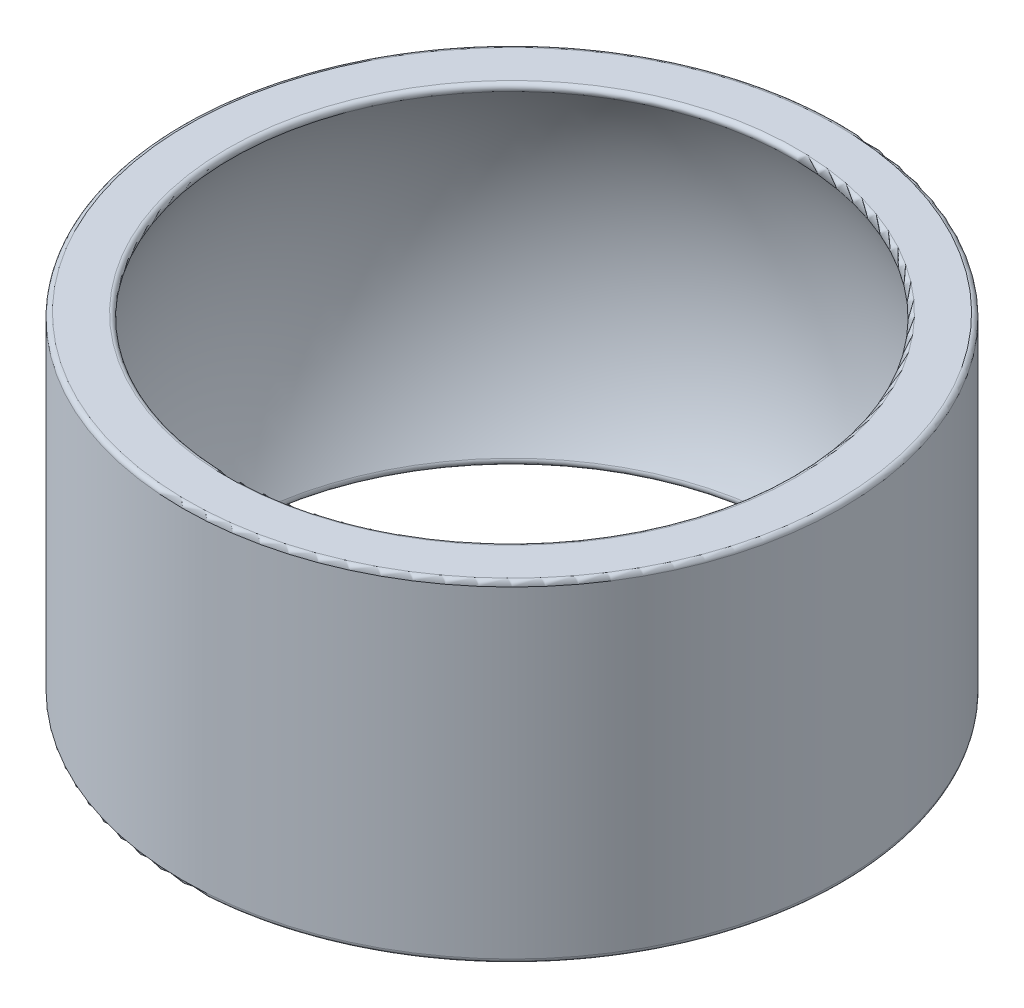
ISO-10303-21;
HEADER;
FILE_DESCRIPTION(('STEP AP214'),'2;1');
FILE_NAME('part.step','',(''),(''),'','','');
FILE_SCHEMA(('AUTOMOTIVE_DESIGN { 1 0 10303 214 1 1 1 1 }'));
ENDSEC;
DATA;
#1=APPLICATION_CONTEXT('core data for automotive mechanical design processes');
#2=APPLICATION_PROTOCOL_DEFINITION('international standard','automotive_design',2000,#1);
#3=PRODUCT_CONTEXT('',#1,'mechanical');
#4=PRODUCT('Part','Part','',(#3));
#5=PRODUCT_RELATED_PRODUCT_CATEGORY('part','',(#4));
#6=PRODUCT_DEFINITION_FORMATION('','',#4);
#7=PRODUCT_DEFINITION_CONTEXT('part definition',#1,'design');
#8=PRODUCT_DEFINITION('design','',#6,#7);
#9=PRODUCT_DEFINITION_SHAPE('','',#8);
#10=(LENGTH_UNIT() NAMED_UNIT(*) SI_UNIT(.MILLI.,.METRE.));
#11=(NAMED_UNIT(*) PLANE_ANGLE_UNIT() SI_UNIT($,.RADIAN.));
#12=(NAMED_UNIT(*) SI_UNIT($,.STERADIAN.) SOLID_ANGLE_UNIT());
#13=UNCERTAINTY_MEASURE_WITH_UNIT(LENGTH_MEASURE(1.E-05),#10,'distance_accuracy_value','');
#14=(GEOMETRIC_REPRESENTATION_CONTEXT(3) GLOBAL_UNCERTAINTY_ASSIGNED_CONTEXT((#13)) GLOBAL_UNIT_ASSIGNED_CONTEXT((#10,
#11,#12)) REPRESENTATION_CONTEXT('',''));
#15=CARTESIAN_POINT('',(0.,0.,0.));
#16=DIRECTION('',(0.,0.,1.));
#17=DIRECTION('',(1.,0.,0.));
#18=AXIS2_PLACEMENT_3D('',#15,#16,#17);
#19=CARTESIAN_POINT('',(0.,11.,0.));
#20=DIRECTION('',(0.,1.,0.));
#21=DIRECTION('',(-1.,0.,0.));
#22=AXIS2_PLACEMENT_3D('',#19,#20,#21);
#23=CYLINDRICAL_SURFACE('',#22,21.8917792789896);
#24=CARTESIAN_POINT('',(0.,-10.7,0.));
#25=DIRECTION('',(0.,1.,0.));
#26=DIRECTION('',(-1.,0.,0.));
#27=AXIS2_PLACEMENT_3D('',#24,#25,#26);
#28=CIRCLE('',#27,21.8917792789896);
#29=CARTESIAN_POINT('',(-21.8917792789896,-10.7,0.));
#30=VERTEX_POINT('',#29);
#31=EDGE_CURVE('E10',#30,#30,#28,.T.);
#32=ORIENTED_EDGE('',*,*,#31,.T.);
#33=EDGE_LOOP('',(#32));
#34=FACE_BOUND('',#33,.T.);
#35=CARTESIAN_POINT('',(0.,10.7,0.));
#36=DIRECTION('',(0.,-1.,0.));
#37=DIRECTION('',(1.,0.,0.));
#38=AXIS2_PLACEMENT_3D('',#35,#36,#37);
#39=CIRCLE('',#38,21.8917792789896);
#40=CARTESIAN_POINT('',(21.8917792789896,10.7,0.));
#41=VERTEX_POINT('',#40);
#42=EDGE_CURVE('E39',#41,#41,#39,.T.);
#43=ORIENTED_EDGE('',*,*,#42,.T.);
#44=EDGE_LOOP('',(#43));
#45=FACE_BOUND('',#44,.T.);
#46=ADVANCED_FACE('F32',(#34,#45),#23,.T.);
#47=CARTESIAN_POINT('',(18.3856091821838,11.,0.));
#48=DIRECTION('',(0.,-1.,0.));
#49=DIRECTION('',(1.,0.,0.));
#50=AXIS2_PLACEMENT_3D('',#47,#48,#49);
#51=PLANE('',#50);
#52=CARTESIAN_POINT('',(0.,11.,0.));
#53=DIRECTION('',(0.,-1.,0.));
#54=DIRECTION('',(1.,0.,0.));
#55=AXIS2_PLACEMENT_3D('',#52,#53,#54);
#56=CIRCLE('',#55,18.9072902606376);
#57=CARTESIAN_POINT('',(18.9072902606376,11.,0.));
#58=VERTEX_POINT('',#57);
#59=EDGE_CURVE('E52',#58,#58,#56,.T.);
#60=ORIENTED_EDGE('',*,*,#59,.T.);
#61=EDGE_LOOP('',(#60));
#62=FACE_BOUND('',#61,.T.);
#63=CARTESIAN_POINT('',(0.,11.,0.));
#64=DIRECTION('',(0.,-1.,0.));
#65=DIRECTION('',(1.,0.,0.));
#66=AXIS2_PLACEMENT_3D('',#63,#64,#65);
#67=CIRCLE('',#66,21.5917792789896);
#68=CARTESIAN_POINT('',(21.5917792789896,11.,0.));
#69=VERTEX_POINT('',#68);
#70=EDGE_CURVE('E55',#69,#69,#67,.F.);
#71=ORIENTED_EDGE('',*,*,#70,.T.);
#72=EDGE_LOOP('',(#71));
#73=FACE_BOUND('',#72,.T.);
#74=ADVANCED_FACE('F88',(#62,#73),#51,.F.);
#75=CARTESIAN_POINT('',(0.,0.,0.));
#76=DIRECTION('',(0.,1.,0.));
#77=DIRECTION('',(1.,0.,0.));
#78=AXIS2_PLACEMENT_3D('',#75,#76,#77);
#79=SPHERICAL_SURFACE('',#78,21.425);
#80=CARTESIAN_POINT('',(0.,10.5522439585731,0.));
#81=DIRECTION('',(0.,-1.,0.));
#82=DIRECTION('',(1.,0.,0.));
#83=AXIS2_PLACEMENT_3D('',#80,#81,#82);
#84=CIRCLE('',#83,18.6461999463365);
#85=CARTESIAN_POINT('',(18.6461999463365,10.5522439585731,0.));
#86=VERTEX_POINT('',#85);
#87=EDGE_CURVE('E58',#86,#86,#84,.F.);
#88=CARTESIAN_POINT('',(0.,-10.5522439585731,0.));
#89=DIRECTION('',(0.,1.,0.));
#90=DIRECTION('',(-1.,0.,0.));
#91=AXIS2_PLACEMENT_3D('',#88,#89,#90);
#92=CIRCLE('',#91,18.6461999463365);
#93=CARTESIAN_POINT('',(18.6461999463365,-10.5522439585731,0.));
#94=VERTEX_POINT('',#93);
#95=EDGE_CURVE('E61',#94,#94,#92,.F.);
#96=CARTESIAN_POINT('',(18.6461999463365,10.5522439585731,0.));
#97=CARTESIAN_POINT('',(18.7594142327355,10.3521929781003,0.));
#98=CARTESIAN_POINT('',(18.8694066548164,10.1503187706505,0.));
#99=CARTESIAN_POINT('',(19.082839184694,9.74313582470225,0.));
#100=CARTESIAN_POINT('',(19.1862792924908,9.53782708620371,0.));
#101=CARTESIAN_POINT('',(19.3864986081518,9.12398700106284,0.));
#102=CARTESIAN_POINT('',(19.4832778160162,8.91545565442051,0.));
#103=CARTESIAN_POINT('',(19.6700754647195,8.49538656742239,0.));
#104=CARTESIAN_POINT('',(19.7600939055585,8.2838488270666,0.));
#105=CARTESIAN_POINT('',(19.933276669133,7.85798602589288,0.));
#106=CARTESIAN_POINT('',(20.0164409918684,7.64366096507496,0.));
#107=CARTESIAN_POINT('',(20.175829398761,7.21244555199515,0.));
#108=CARTESIAN_POINT('',(20.2520534829181,6.99555519973325,0.));
#109=CARTESIAN_POINT('',(20.39748244643,6.55943387177243,0.));
#110=CARTESIAN_POINT('',(20.4666873257849,6.34020289607352,0.));
#111=CARTESIAN_POINT('',(20.5980061938811,5.89962741875934,0.));
#112=CARTESIAN_POINT('',(20.6601201826226,5.67828291714407,0.));
#113=CARTESIAN_POINT('',(20.7771929264645,5.23370967355551,0.));
#114=CARTESIAN_POINT('',(20.8321516815649,5.01048093158222,0.));
#115=CARTESIAN_POINT('',(20.9348570277174,4.56237044503139,0.));
#116=CARTESIAN_POINT('',(20.9826036187695,4.33748870045383,0.));
#117=CARTESIAN_POINT('',(21.0708351771574,3.88630515866224,0.));
#118=CARTESIAN_POINT('',(21.1113201444933,3.6600033614482,0.));
#119=CARTESIAN_POINT('',(21.1849865179836,3.20621413537763,0.));
#120=CARTESIAN_POINT('',(21.218167924138,2.97872670652108,0.));
#121=CARTESIAN_POINT('',(21.2771928033836,2.5228018663221,0.));
#122=CARTESIAN_POINT('',(21.3030362764747,2.29436445497966,0.));
#123=CARTESIAN_POINT('',(21.3473585189165,1.83677628303297,0.));
#124=CARTESIAN_POINT('',(21.3658372882671,1.60762552242872,0.));
#125=CARTESIAN_POINT('',(21.3954109814823,1.14884802412465,0.));
#126=CARTESIAN_POINT('',(21.406505905347,0.919221286424819,0.));
#127=CARTESIAN_POINT('',(21.4213004146058,0.459729699149995,0.));
#128=CARTESIAN_POINT('',(21.425,0.229864849574999,0.));
#129=CARTESIAN_POINT('',(21.425,-0.229864849574993,0.));
#130=CARTESIAN_POINT('',(21.4213004146058,-0.459729699149989,0.));
#131=CARTESIAN_POINT('',(21.406505905347,-0.919221286424813,0.));
#132=CARTESIAN_POINT('',(21.3954109814824,-1.14884802412464,0.));
#133=CARTESIAN_POINT('',(21.3658372882671,-1.60762552242871,0.));
#134=CARTESIAN_POINT('',(21.3473585189165,-1.83677628303296,0.));
#135=CARTESIAN_POINT('',(21.3030362764747,-2.29436445497965,0.));
#136=CARTESIAN_POINT('',(21.2771928033836,-2.52280186632209,0.));
#137=CARTESIAN_POINT('',(21.218167924138,-2.97872670652108,0.));
#138=CARTESIAN_POINT('',(21.1849865179836,-3.20621413537762,0.));
#139=CARTESIAN_POINT('',(21.1113201444933,-3.6600033614482,0.));
#140=CARTESIAN_POINT('',(21.0708351771574,-3.88630515866224,0.));
#141=CARTESIAN_POINT('',(20.9826036187695,-4.33748870045383,0.));
#142=CARTESIAN_POINT('',(20.9348570277174,-4.56237044503138,0.));
#143=CARTESIAN_POINT('',(20.8321516815649,-5.01048093158222,0.));
#144=CARTESIAN_POINT('',(20.7771929264645,-5.2337096735555,0.));
#145=CARTESIAN_POINT('',(20.6601201826226,-5.67828291714406,0.));
#146=CARTESIAN_POINT('',(20.5980061938811,-5.89962741875933,0.));
#147=CARTESIAN_POINT('',(20.4666873257849,-6.34020289607352,0.));
#148=CARTESIAN_POINT('',(20.39748244643,-6.55943387177243,0.));
#149=CARTESIAN_POINT('',(20.2520534829181,-6.99555519973324,0.));
#150=CARTESIAN_POINT('',(20.175829398761,-7.21244555199514,0.));
#151=CARTESIAN_POINT('',(20.0164409918684,-7.64366096507496,0.));
#152=CARTESIAN_POINT('',(19.933276669133,-7.85798602589288,0.));
#153=CARTESIAN_POINT('',(19.7600939055585,-8.28384882706659,0.));
#154=CARTESIAN_POINT('',(19.6700754647195,-8.49538656742238,0.));
#155=CARTESIAN_POINT('',(19.4832778160162,-8.9154556544205,0.));
#156=CARTESIAN_POINT('',(19.3864986081518,-9.12398700106283,0.));
#157=CARTESIAN_POINT('',(19.1862792924908,-9.5378270862037,0.));
#158=CARTESIAN_POINT('',(19.082839184694,-9.74313582470224,0.));
#159=CARTESIAN_POINT('',(18.8694066548164,-10.1503187706505,0.));
#160=CARTESIAN_POINT('',(18.7594142327355,-10.3521929781002,0.));
#161=CARTESIAN_POINT('',(18.6461999463365,-10.5522439585731,0.));
#162=B_SPLINE_CURVE_WITH_KNOTS('',3,(#96,#97,#98,#99,#100,#101,#102,#103,#104,#105,#106,#107,
#108,#109,#110,#111,#112,#113,#114,#115,#116,#117,#118,#119,#120,#121,#122,#123,#124,#125,#126,
#127,#128,#129,#130,#131,#132,#133,#134,#135,#136,#137,#138,#139,#140,#141,#142,#143,#144,#145,
#146,#147,#148,#149,#150,#151,#152,#153,#154,#155,#156,#157,#158,#159,#160,#161),.UNSPECIFIED.,
.F.,.F.,(4,2,2,2,2,2,2,2,2,2,2,2,2,2,2,2,2,2,2,2,2,2,2,2,2,2,2,2,2,2,2,2,4),(0.,
0.689564786668334,1.37912957333666,2.068694360005,2.75825914667333,3.44782393334166,
4.13738872001,4.82695350667833,5.51651829334666,6.20608308001499,6.89564786668333,
7.58521265335166,8.27477744001999,8.96434222668833,9.65390701335666,10.343471800025,
11.0330365866933,11.7226013733617,12.41216616003,13.1017309466983,13.7912957333667,
14.480860520035,15.1704253067033,15.8599900933717,16.54955488004,17.2391196667083,
17.9286844533767,18.618249240045,19.3078140267133,19.9973788133817,20.68694360005,
21.3765083867183,22.0660731733866),.UNSPECIFIED.);
#163=EDGE_CURVE('BSEAM65',#86,#94,#162,.T.);
#164=ORIENTED_EDGE('',*,*,#87,.T.);
#165=ORIENTED_EDGE('',*,*,#95,.T.);
#166=ORIENTED_EDGE('',*,*,#163,.T.);
#167=ORIENTED_EDGE('',*,*,#163,.F.);
#168=EDGE_LOOP('',(#164,#166,#165,#167));
#169=FACE_BOUND('',#168,.T.);
#170=ADVANCED_FACE('F65',(#169),#79,.F.);
#171=CARTESIAN_POINT('',(18.3856091821838,-11.,0.));
#172=DIRECTION('',(0.,1.,0.));
#173=DIRECTION('',(-1.,0.,0.));
#174=AXIS2_PLACEMENT_3D('',#171,#172,#173);
#175=PLANE('',#174);
#176=CARTESIAN_POINT('',(0.,-11.,0.));
#177=DIRECTION('',(0.,1.,0.));
#178=DIRECTION('',(-1.,0.,0.));
#179=AXIS2_PLACEMENT_3D('',#176,#177,#178);
#180=CIRCLE('',#179,18.9072902606376);
#181=CARTESIAN_POINT('',(-18.9072902606376,-11.,0.));
#182=VERTEX_POINT('',#181);
#183=EDGE_CURVE('E43',#182,#182,#180,.T.);
#184=ORIENTED_EDGE('',*,*,#183,.T.);
#185=EDGE_LOOP('',(#184));
#186=FACE_BOUND('',#185,.T.);
#187=CARTESIAN_POINT('',(0.,-11.,0.));
#188=DIRECTION('',(0.,1.,0.));
#189=DIRECTION('',(-1.,0.,0.));
#190=AXIS2_PLACEMENT_3D('',#187,#188,#189);
#191=CIRCLE('',#190,21.5917792789896);
#192=CARTESIAN_POINT('',(-21.5917792789896,-11.,0.));
#193=VERTEX_POINT('',#192);
#194=EDGE_CURVE('E47',#193,#193,#191,.F.);
#195=ORIENTED_EDGE('',*,*,#194,.T.);
#196=EDGE_LOOP('',(#195));
#197=FACE_BOUND('',#196,.T.);
#198=ADVANCED_FACE('F75',(#186,#197),#175,.F.);
#199=CARTESIAN_POINT('',(0.,10.7,0.));
#200=DIRECTION('',(0.,-1.,0.));
#201=DIRECTION('',(1.,0.,0.));
#202=AXIS2_PLACEMENT_3D('',#199,#200,#201);
#203=TOROIDAL_SURFACE('',#202,18.9072902606376,0.3);
#204=ORIENTED_EDGE('',*,*,#59,.F.);
#205=EDGE_LOOP('',(#204));
#206=FACE_BOUND('',#205,.T.);
#207=ORIENTED_EDGE('',*,*,#87,.F.);
#208=EDGE_LOOP('',(#207));
#209=FACE_BOUND('',#208,.T.);
#210=ADVANCED_FACE('F71',(#206,#209),#203,.T.);
#211=CARTESIAN_POINT('',(0.,-10.7,0.));
#212=DIRECTION('',(0.,1.,0.));
#213=DIRECTION('',(-1.,0.,0.));
#214=AXIS2_PLACEMENT_3D('',#211,#212,#213);
#215=TOROIDAL_SURFACE('',#214,18.9072902606376,0.3);
#216=ORIENTED_EDGE('',*,*,#95,.F.);
#217=EDGE_LOOP('',(#216));
#218=FACE_BOUND('',#217,.T.);
#219=ORIENTED_EDGE('',*,*,#183,.F.);
#220=EDGE_LOOP('',(#219));
#221=FACE_BOUND('',#220,.T.);
#222=ADVANCED_FACE('F67',(#218,#221),#215,.T.);
#223=CARTESIAN_POINT('',(0.,-10.7,0.));
#224=DIRECTION('',(0.,1.,0.));
#225=DIRECTION('',(-1.,0.,0.));
#226=AXIS2_PLACEMENT_3D('',#223,#224,#225);
#227=TOROIDAL_SURFACE('',#226,21.5917792789896,0.3);
#228=ORIENTED_EDGE('',*,*,#194,.F.);
#229=EDGE_LOOP('',(#228));
#230=FACE_BOUND('',#229,.T.);
#231=ORIENTED_EDGE('',*,*,#31,.F.);
#232=EDGE_LOOP('',(#231));
#233=FACE_BOUND('',#232,.T.);
#234=ADVANCED_FACE('F70',(#230,#233),#227,.T.);
#235=CARTESIAN_POINT('',(0.,10.7,0.));
#236=DIRECTION('',(0.,-1.,0.));
#237=DIRECTION('',(1.,0.,0.));
#238=AXIS2_PLACEMENT_3D('',#235,#236,#237);
#239=TOROIDAL_SURFACE('',#238,21.5917792789896,0.3);
#240=ORIENTED_EDGE('',*,*,#42,.F.);
#241=EDGE_LOOP('',(#240));
#242=FACE_BOUND('',#241,.T.);
#243=ORIENTED_EDGE('',*,*,#70,.F.);
#244=EDGE_LOOP('',(#243));
#245=FACE_BOUND('',#244,.T.);
#246=ADVANCED_FACE('F34',(#242,#245),#239,.T.);
#247=CLOSED_SHELL('',(#46,#74,#170,#198,#210,#222,#234,#246));
#248=MANIFOLD_SOLID_BREP('B2',#247);
#249=ADVANCED_BREP_SHAPE_REPRESENTATION('',(#18,#248),#14);
#250=SHAPE_DEFINITION_REPRESENTATION(#9,#249);
ENDSEC;
END-ISO-10303-21;
